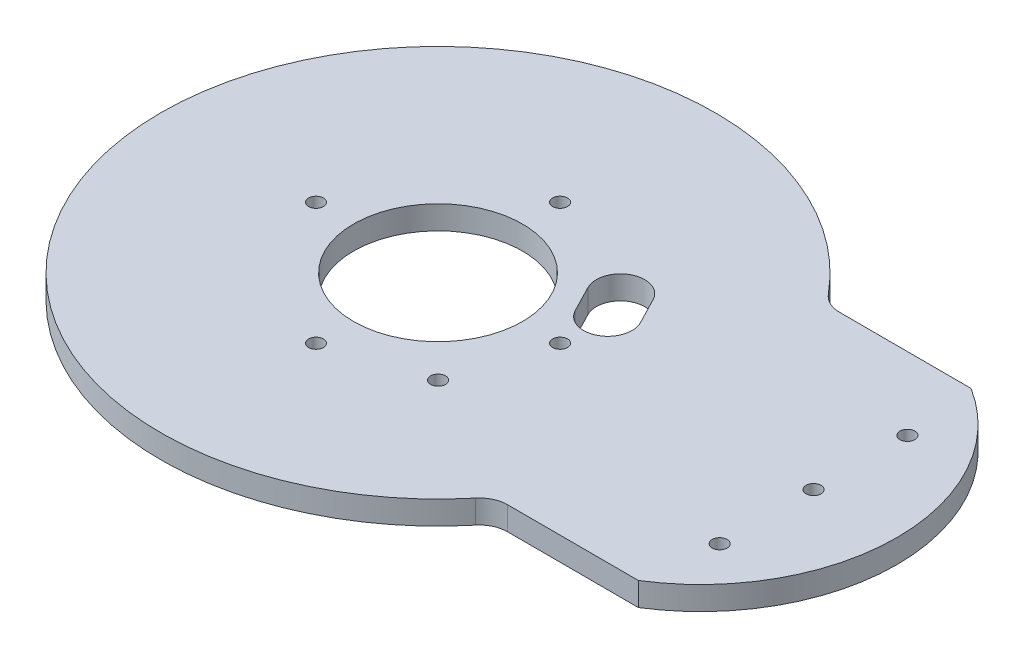
ISO-10303-21;
HEADER;
FILE_DESCRIPTION(('STEP AP214'),'2;1');
FILE_NAME('part.step','',(''),(''),'','','');
FILE_SCHEMA(('AUTOMOTIVE_DESIGN { 1 0 10303 214 1 1 1 1 }'));
ENDSEC;
DATA;
#1=APPLICATION_CONTEXT('core data for automotive mechanical design processes');
#2=APPLICATION_PROTOCOL_DEFINITION('international standard','automotive_design',2000,#1);
#3=PRODUCT_CONTEXT('',#1,'mechanical');
#4=PRODUCT('Part','Part','',(#3));
#5=PRODUCT_RELATED_PRODUCT_CATEGORY('part','',(#4));
#6=PRODUCT_DEFINITION_FORMATION('','',#4);
#7=PRODUCT_DEFINITION_CONTEXT('part definition',#1,'design');
#8=PRODUCT_DEFINITION('design','',#6,#7);
#9=PRODUCT_DEFINITION_SHAPE('','',#8);
#10=(LENGTH_UNIT() NAMED_UNIT(*) SI_UNIT(.MILLI.,.METRE.));
#11=(NAMED_UNIT(*) PLANE_ANGLE_UNIT() SI_UNIT($,.RADIAN.));
#12=(NAMED_UNIT(*) SI_UNIT($,.STERADIAN.) SOLID_ANGLE_UNIT());
#13=UNCERTAINTY_MEASURE_WITH_UNIT(LENGTH_MEASURE(1.E-05),#10,'distance_accuracy_value','');
#14=(GEOMETRIC_REPRESENTATION_CONTEXT(3) GLOBAL_UNCERTAINTY_ASSIGNED_CONTEXT((#13)) GLOBAL_UNIT_ASSIGNED_CONTEXT((#10,
#11,#12)) REPRESENTATION_CONTEXT('',''));
#15=CARTESIAN_POINT('',(0.,0.,0.));
#16=DIRECTION('',(0.,0.,1.));
#17=DIRECTION('',(1.,0.,0.));
#18=AXIS2_PLACEMENT_3D('',#15,#16,#17);
#19=CARTESIAN_POINT('',(-75.0000000000001,6.35,0.));
#20=DIRECTION('',(0.,1.,0.));
#21=DIRECTION('',(0.,0.,1.));
#22=AXIS2_PLACEMENT_3D('',#19,#20,#21);
#23=PLANE('',#22);
#24=CARTESIAN_POINT('',(-45.4313890152023,6.35,-19.8022772061494));
#25=DIRECTION('',(0.,1.,0.));
#26=DIRECTION('',(0.,0.,1.));
#27=AXIS2_PLACEMENT_3D('',#24,#25,#26);
#28=CIRCLE('',#27,6.55197648199999);
#29=CARTESIAN_POINT('',(-39.6125329501203,6.35,-22.8138067036871));
#30=VERTEX_POINT('',#29);
#31=CARTESIAN_POINT('',(-51.2502450802842,6.35,-16.7907477086116));
#32=VERTEX_POINT('',#31);
#33=EDGE_CURVE('E47',#30,#32,#28,.T.);
#34=ORIENTED_EDGE('',*,*,#33,.F.);
#35=DIRECTION('',(-0.459636799034804,0.,-0.888106982842179));
#36=VECTOR('',#35,1.);
#37=CARTESIAN_POINT('',(-39.6125329501203,6.35,-22.8138067036871));
#38=LINE('',#37,#36);
#39=CARTESIAN_POINT('',(-35.9393740067247,6.35,-15.7165548875378));
#40=VERTEX_POINT('',#39);
#41=EDGE_CURVE('E126',#40,#30,#38,.T.);
#42=ORIENTED_EDGE('',*,*,#41,.F.);
#43=CARTESIAN_POINT('',(-41.7582300718067,6.35,-12.70502539));
#44=DIRECTION('',(0.,1.,0.));
#45=DIRECTION('',(0.,0.,1.));
#46=AXIS2_PLACEMENT_3D('',#43,#44,#45);
#47=CIRCLE('',#46,6.551976482);
#48=CARTESIAN_POINT('',(-47.5770861368886,6.35,-9.69349589246222));
#49=VERTEX_POINT('',#48);
#50=EDGE_CURVE('E129',#49,#40,#47,.T.);
#51=ORIENTED_EDGE('',*,*,#50,.F.);
#52=DIRECTION('',(0.459636799034802,0.,0.888106982842181));
#53=VECTOR('',#52,1.);
#54=CARTESIAN_POINT('',(-51.2502450802842,6.35,-16.7907477086116));
#55=LINE('',#54,#53);
#56=EDGE_CURVE('E135',#32,#49,#55,.T.);
#57=ORIENTED_EDGE('',*,*,#56,.F.);
#58=EDGE_LOOP('',(#34,#42,#51,#57));
#59=FACE_BOUND('',#58,.T.);
#60=CARTESIAN_POINT('',(26.5999999999999,6.35,0.));
#61=DIRECTION('',(0.,1.,0.));
#62=DIRECTION('',(0.,0.,1.));
#63=AXIS2_PLACEMENT_3D('',#60,#61,#62);
#64=CIRCLE('',#63,2.01930000000001);
#65=CARTESIAN_POINT('',(26.5999999999999,6.35,2.0193));
#66=VERTEX_POINT('',#65);
#67=EDGE_CURVE('E198',#66,#66,#64,.T.);
#68=ORIENTED_EDGE('',*,*,#67,.F.);
#69=EDGE_LOOP('',(#68));
#70=FACE_BOUND('',#69,.T.);
#71=CARTESIAN_POINT('',(-75.0000000000001,6.34999999999999,0.));
#72=DIRECTION('',(0.,1.,0.));
#73=DIRECTION('',(0.,0.,1.));
#74=AXIS2_PLACEMENT_3D('',#71,#72,#73);
#75=CIRCLE('',#74,22.86);
#76=CARTESIAN_POINT('',(-75.0000000000001,6.34999999999999,22.86));
#77=VERTEX_POINT('',#76);
#78=EDGE_CURVE('E189',#77,#77,#75,.T.);
#79=ORIENTED_EDGE('',*,*,#78,.F.);
#80=EDGE_LOOP('',(#79));
#81=FACE_BOUND('',#80,.T.);
#82=CARTESIAN_POINT('',(-49.8362072459857,6.34999999999999,25.1637927540141));
#83=DIRECTION('',(0.,1.,0.));
#84=DIRECTION('',(0.,0.,1.));
#85=AXIS2_PLACEMENT_3D('',#82,#83,#84);
#86=CIRCLE('',#85,2.0193);
#87=CARTESIAN_POINT('',(-49.8362072459857,6.34999999999999,27.1830927540141));
#88=VERTEX_POINT('',#87);
#89=EDGE_CURVE('E183',#88,#88,#86,.T.);
#90=ORIENTED_EDGE('',*,*,#89,.F.);
#91=EDGE_LOOP('',(#90));
#92=FACE_BOUND('',#91,.T.);
#93=CARTESIAN_POINT('',(-41.980000000001,6.34999999999999,-5.68989300120393E-13));
#94=DIRECTION('',(0.,1.,0.));
#95=DIRECTION('',(0.,0.,1.));
#96=AXIS2_PLACEMENT_3D('',#93,#94,#95);
#97=CIRCLE('',#96,2.0193);
#98=CARTESIAN_POINT('',(-41.980000000001,6.34999999999999,2.01929999999943));
#99=VERTEX_POINT('',#98);
#100=EDGE_CURVE('E177',#99,#99,#97,.T.);
#101=ORIENTED_EDGE('',*,*,#100,.F.);
#102=EDGE_LOOP('',(#101));
#103=FACE_BOUND('',#102,.T.);
#104=CARTESIAN_POINT('',(-75.0000000000001,6.34999999999999,33.02));
#105=DIRECTION('',(0.,1.,0.));
#106=DIRECTION('',(0.,0.,1.));
#107=AXIS2_PLACEMENT_3D('',#104,#105,#106);
#108=CIRCLE('',#107,2.01930000000001);
#109=CARTESIAN_POINT('',(-75.0000000000001,6.34999999999999,35.0393));
#110=VERTEX_POINT('',#109);
#111=EDGE_CURVE('E171',#110,#110,#108,.T.);
#112=ORIENTED_EDGE('',*,*,#111,.F.);
#113=EDGE_LOOP('',(#112));
#114=FACE_BOUND('',#113,.T.);
#115=CARTESIAN_POINT('',(-108.020000000001,6.34999999999999,8.32667268468867E-13));
#116=DIRECTION('',(0.,1.,0.));
#117=DIRECTION('',(0.,0.,1.));
#118=AXIS2_PLACEMENT_3D('',#115,#116,#117);
#119=CIRCLE('',#118,2.01930000000001);
#120=CARTESIAN_POINT('',(-108.020000000001,6.34999999999999,2.01930000000084));
#121=VERTEX_POINT('',#120);
#122=EDGE_CURVE('E165',#121,#121,#119,.T.);
#123=ORIENTED_EDGE('',*,*,#122,.F.);
#124=EDGE_LOOP('',(#123));
#125=FACE_BOUND('',#124,.T.);
#126=CARTESIAN_POINT('',(-75.0000000000017,6.34999999999999,-33.02));
#127=DIRECTION('',(0.,1.,0.));
#128=DIRECTION('',(0.,0.,1.));
#129=AXIS2_PLACEMENT_3D('',#126,#127,#128);
#130=CIRCLE('',#129,2.0193);
#131=CARTESIAN_POINT('',(-75.0000000000017,6.34999999999999,-31.0007));
#132=VERTEX_POINT('',#131);
#133=EDGE_CURVE('E161',#132,#132,#130,.T.);
#134=ORIENTED_EDGE('',*,*,#133,.F.);
#135=EDGE_LOOP('',(#134));
#136=FACE_BOUND('',#135,.T.);
#137=CARTESIAN_POINT('',(26.5999999999999,6.35,25.4));
#138=DIRECTION('',(0.,1.,0.));
#139=DIRECTION('',(0.,0.,1.));
#140=AXIS2_PLACEMENT_3D('',#137,#138,#139);
#141=CIRCLE('',#140,2.0193);
#142=CARTESIAN_POINT('',(26.5999999999999,6.35,27.4193));
#143=VERTEX_POINT('',#142);
#144=EDGE_CURVE('E155',#143,#143,#141,.T.);
#145=ORIENTED_EDGE('',*,*,#144,.F.);
#146=EDGE_LOOP('',(#145));
#147=FACE_BOUND('',#146,.T.);
#148=CARTESIAN_POINT('',(26.5999999999999,6.35,-25.4));
#149=DIRECTION('',(0.,1.,0.));
#150=DIRECTION('',(0.,0.,1.));
#151=AXIS2_PLACEMENT_3D('',#148,#149,#150);
#152=CIRCLE('',#151,2.0193);
#153=CARTESIAN_POINT('',(26.5999999999999,6.35,-23.3807));
#154=VERTEX_POINT('',#153);
#155=EDGE_CURVE('E148',#154,#154,#152,.T.);
#156=ORIENTED_EDGE('',*,*,#155,.F.);
#157=EDGE_LOOP('',(#156));
#158=FACE_BOUND('',#157,.T.);
#159=CARTESIAN_POINT('',(-3.94349539851306,6.35,0.));
#160=DIRECTION('',(0.,-1.,0.));
#161=DIRECTION('',(0.,0.,-1.));
#162=AXIS2_PLACEMENT_3D('',#159,#160,#161);
#163=CIRCLE('',#162,53.0754726752629);
#164=CARTESIAN_POINT('',(24.1991727609629,6.35,-44.9999558729583));
#165=VERTEX_POINT('',#164);
#166=CARTESIAN_POINT('',(24.1991727609629,6.35,44.9999558729584));
#167=VERTEX_POINT('',#166);
#168=EDGE_CURVE('E141',#165,#167,#163,.T.);
#169=ORIENTED_EDGE('',*,*,#168,.F.);
#170=DIRECTION('',(-0.999998670387748,0.,-0.00163071233998099));
#171=VECTOR('',#170,1.);
#172=CARTESIAN_POINT('',(24.1991727609629,6.35,-44.9999558729584));
#173=LINE('',#172,#171);
#174=CARTESIAN_POINT('',(-11.3627251739013,6.35,-45.0579471758599));
#175=VERTEX_POINT('',#174);
#176=EDGE_CURVE('E211',#165,#175,#173,.T.);
#177=ORIENTED_EDGE('',*,*,#176,.T.);
#178=CARTESIAN_POINT('',(-11.3502991458706,6.35,-52.6779370442145));
#179=DIRECTION('',(0.,1.,0.));
#180=DIRECTION('',(0.,0.,1.));
#181=AXIS2_PLACEMENT_3D('',#178,#179,#180);
#182=CIRCLE('',#181,7.62);
#183=CARTESIAN_POINT('',(-17.2205986589789,6.35,-47.81954393266));
#184=VERTEX_POINT('',#183);
#185=EDGE_CURVE('E11',#175,#184,#182,.F.);
#186=ORIENTED_EDGE('',*,*,#185,.T.);
#187=CARTESIAN_POINT('',(-75.0000000000001,6.35,0.));
#188=DIRECTION('',(0.,1.,0.));
#189=DIRECTION('',(0.,0.,1.));
#190=AXIS2_PLACEMENT_3D('',#187,#188,#189);
#191=CIRCLE('',#190,75.00112);
#192=CARTESIAN_POINT('',(-17.1337702696779,6.35,47.7144365790058));
#193=VERTEX_POINT('',#192);
#194=EDGE_CURVE('E204',#184,#193,#191,.T.);
#195=ORIENTED_EDGE('',*,*,#194,.T.);
#196=CARTESIAN_POINT('',(-11.2546491239529,6.35,52.5621509428983));
#197=DIRECTION('',(0.,1.,0.));
#198=DIRECTION('',(0.,0.,1.));
#199=AXIS2_PLACEMENT_3D('',#196,#197,#198);
#200=CIRCLE('',#199,7.62);
#201=CARTESIAN_POINT('',(-11.2422230959222,6.35,44.9421610745437));
#202=VERTEX_POINT('',#201);
#203=EDGE_CURVE('E238',#193,#202,#200,.F.);
#204=ORIENTED_EDGE('',*,*,#203,.T.);
#205=DIRECTION('',(0.999998670387748,0.,0.00163071233998107));
#206=VECTOR('',#205,1.);
#207=CARTESIAN_POINT('',(24.1991727609629,6.35,44.9999558729583));
#208=LINE('',#207,#206);
#209=EDGE_CURVE('E207',#202,#167,#208,.T.);
#210=ORIENTED_EDGE('',*,*,#209,.T.);
#211=EDGE_LOOP('',(#169,#177,#186,#195,#204,#210));
#212=FACE_BOUND('',#211,.T.);
#213=ADVANCED_FACE('F32',(#59,#70,#81,#92,#103,#114,#125,#136,#147,#158,#212),#23,.T.);
#214=CARTESIAN_POINT('',(-75.0000000000001,0.,0.));
#215=DIRECTION('',(0.,1.,0.));
#216=DIRECTION('',(0.,0.,1.));
#217=AXIS2_PLACEMENT_3D('',#214,#215,#216);
#218=PLANE('',#217);
#219=DIRECTION('',(-0.459636799034804,0.,-0.888106982842179));
#220=VECTOR('',#219,1.);
#221=CARTESIAN_POINT('',(-39.6125329501203,0.,-22.8138067036871));
#222=LINE('',#221,#220);
#223=CARTESIAN_POINT('',(-35.9393740067247,0.,-15.7165548875378));
#224=VERTEX_POINT('',#223);
#225=CARTESIAN_POINT('',(-39.6125329501203,0.,-22.8138067036871));
#226=VERTEX_POINT('',#225);
#227=EDGE_CURVE('E116',#224,#226,#222,.T.);
#228=ORIENTED_EDGE('',*,*,#227,.T.);
#229=CARTESIAN_POINT('',(-45.4313890152023,0.,-19.8022772061494));
#230=DIRECTION('',(0.,1.,0.));
#231=DIRECTION('',(0.,0.,1.));
#232=AXIS2_PLACEMENT_3D('',#229,#230,#231);
#233=CIRCLE('',#232,6.55197648199999);
#234=CARTESIAN_POINT('',(-51.2502450802842,0.,-16.7907477086116));
#235=VERTEX_POINT('',#234);
#236=EDGE_CURVE('E110',#226,#235,#233,.T.);
#237=ORIENTED_EDGE('',*,*,#236,.T.);
#238=DIRECTION('',(0.459636799034802,0.,0.888106982842181));
#239=VECTOR('',#238,1.);
#240=CARTESIAN_POINT('',(-51.2502450802842,0.,-16.7907477086116));
#241=LINE('',#240,#239);
#242=CARTESIAN_POINT('',(-47.5770861368886,0.,-9.69349589246222));
#243=VERTEX_POINT('',#242);
#244=EDGE_CURVE('E119',#235,#243,#241,.T.);
#245=ORIENTED_EDGE('',*,*,#244,.T.);
#246=CARTESIAN_POINT('',(-41.7582300718067,0.,-12.70502539));
#247=DIRECTION('',(0.,1.,0.));
#248=DIRECTION('',(0.,0.,1.));
#249=AXIS2_PLACEMENT_3D('',#246,#247,#248);
#250=CIRCLE('',#249,6.551976482);
#251=EDGE_CURVE('E55',#243,#224,#250,.T.);
#252=ORIENTED_EDGE('',*,*,#251,.T.);
#253=EDGE_LOOP('',(#228,#237,#245,#252));
#254=FACE_BOUND('',#253,.T.);
#255=CARTESIAN_POINT('',(26.5999999999999,0.,-25.4));
#256=DIRECTION('',(0.,1.,0.));
#257=DIRECTION('',(0.,0.,1.));
#258=AXIS2_PLACEMENT_3D('',#255,#256,#257);
#259=CIRCLE('',#258,2.0193);
#260=CARTESIAN_POINT('',(26.5999999999999,0.,-23.3807));
#261=VERTEX_POINT('',#260);
#262=EDGE_CURVE('E152',#261,#261,#259,.T.);
#263=ORIENTED_EDGE('',*,*,#262,.T.);
#264=EDGE_LOOP('',(#263));
#265=FACE_BOUND('',#264,.T.);
#266=CARTESIAN_POINT('',(26.5999999999999,0.,25.4));
#267=DIRECTION('',(0.,1.,0.));
#268=DIRECTION('',(0.,0.,1.));
#269=AXIS2_PLACEMENT_3D('',#266,#267,#268);
#270=CIRCLE('',#269,2.0193);
#271=CARTESIAN_POINT('',(26.5999999999999,0.,27.4193));
#272=VERTEX_POINT('',#271);
#273=EDGE_CURVE('E158',#272,#272,#270,.T.);
#274=ORIENTED_EDGE('',*,*,#273,.T.);
#275=EDGE_LOOP('',(#274));
#276=FACE_BOUND('',#275,.T.);
#277=CARTESIAN_POINT('',(-75.0000000000017,0.,-33.02));
#278=DIRECTION('',(0.,1.,0.));
#279=DIRECTION('',(0.,0.,1.));
#280=AXIS2_PLACEMENT_3D('',#277,#278,#279);
#281=CIRCLE('',#280,2.0193);
#282=CARTESIAN_POINT('',(-75.0000000000017,0.,-31.0007));
#283=VERTEX_POINT('',#282);
#284=EDGE_CURVE('E162',#283,#283,#281,.T.);
#285=ORIENTED_EDGE('',*,*,#284,.T.);
#286=EDGE_LOOP('',(#285));
#287=FACE_BOUND('',#286,.T.);
#288=CARTESIAN_POINT('',(-108.020000000001,0.,8.32667268468867E-13));
#289=DIRECTION('',(0.,1.,0.));
#290=DIRECTION('',(0.,0.,1.));
#291=AXIS2_PLACEMENT_3D('',#288,#289,#290);
#292=CIRCLE('',#291,2.01930000000001);
#293=CARTESIAN_POINT('',(-108.020000000001,0.,2.01930000000084));
#294=VERTEX_POINT('',#293);
#295=EDGE_CURVE('E168',#294,#294,#292,.T.);
#296=ORIENTED_EDGE('',*,*,#295,.T.);
#297=EDGE_LOOP('',(#296));
#298=FACE_BOUND('',#297,.T.);
#299=CARTESIAN_POINT('',(-75.0000000000001,0.,33.02));
#300=DIRECTION('',(0.,1.,0.));
#301=DIRECTION('',(0.,0.,1.));
#302=AXIS2_PLACEMENT_3D('',#299,#300,#301);
#303=CIRCLE('',#302,2.01930000000001);
#304=CARTESIAN_POINT('',(-75.0000000000001,0.,35.0393));
#305=VERTEX_POINT('',#304);
#306=EDGE_CURVE('E174',#305,#305,#303,.T.);
#307=ORIENTED_EDGE('',*,*,#306,.T.);
#308=EDGE_LOOP('',(#307));
#309=FACE_BOUND('',#308,.T.);
#310=CARTESIAN_POINT('',(-41.980000000001,0.,-5.68989300120393E-13));
#311=DIRECTION('',(0.,1.,0.));
#312=DIRECTION('',(0.,0.,1.));
#313=AXIS2_PLACEMENT_3D('',#310,#311,#312);
#314=CIRCLE('',#313,2.0193);
#315=CARTESIAN_POINT('',(-41.980000000001,0.,2.01929999999943));
#316=VERTEX_POINT('',#315);
#317=EDGE_CURVE('E180',#316,#316,#314,.T.);
#318=ORIENTED_EDGE('',*,*,#317,.T.);
#319=EDGE_LOOP('',(#318));
#320=FACE_BOUND('',#319,.T.);
#321=CARTESIAN_POINT('',(-49.8362072459857,0.,25.1637927540141));
#322=DIRECTION('',(0.,1.,0.));
#323=DIRECTION('',(0.,0.,1.));
#324=AXIS2_PLACEMENT_3D('',#321,#322,#323);
#325=CIRCLE('',#324,2.0193);
#326=CARTESIAN_POINT('',(-49.8362072459857,0.,27.1830927540141));
#327=VERTEX_POINT('',#326);
#328=EDGE_CURVE('E186',#327,#327,#325,.T.);
#329=ORIENTED_EDGE('',*,*,#328,.T.);
#330=EDGE_LOOP('',(#329));
#331=FACE_BOUND('',#330,.T.);
#332=CARTESIAN_POINT('',(-75.0000000000001,0.,0.));
#333=DIRECTION('',(0.,1.,0.));
#334=DIRECTION('',(0.,0.,1.));
#335=AXIS2_PLACEMENT_3D('',#332,#333,#334);
#336=CIRCLE('',#335,22.86);
#337=CARTESIAN_POINT('',(-75.0000000000001,0.,22.86));
#338=VERTEX_POINT('',#337);
#339=EDGE_CURVE('E192',#338,#338,#336,.T.);
#340=ORIENTED_EDGE('',*,*,#339,.T.);
#341=EDGE_LOOP('',(#340));
#342=FACE_BOUND('',#341,.T.);
#343=CARTESIAN_POINT('',(26.5999999999999,0.,0.));
#344=DIRECTION('',(0.,1.,0.));
#345=DIRECTION('',(0.,0.,1.));
#346=AXIS2_PLACEMENT_3D('',#343,#344,#345);
#347=CIRCLE('',#346,2.01930000000001);
#348=CARTESIAN_POINT('',(26.5999999999999,0.,2.0193));
#349=VERTEX_POINT('',#348);
#350=EDGE_CURVE('E195',#349,#349,#347,.T.);
#351=ORIENTED_EDGE('',*,*,#350,.T.);
#352=EDGE_LOOP('',(#351));
#353=FACE_BOUND('',#352,.T.);
#354=DIRECTION('',(-0.999998670387748,0.,-0.00163071233998099));
#355=VECTOR('',#354,1.);
#356=CARTESIAN_POINT('',(24.1991727609629,0.,-44.9999558729584));
#357=LINE('',#356,#355);
#358=CARTESIAN_POINT('',(24.1991727609629,0.,-44.9999558729584));
#359=VERTEX_POINT('',#358);
#360=CARTESIAN_POINT('',(-11.3627251739013,0.,-45.0579471758599));
#361=VERTEX_POINT('',#360);
#362=EDGE_CURVE('E208',#359,#361,#357,.T.);
#363=ORIENTED_EDGE('',*,*,#362,.F.);
#364=CARTESIAN_POINT('',(-3.94349539851306,0.,0.));
#365=DIRECTION('',(0.,-1.,0.));
#366=DIRECTION('',(0.,0.,-1.));
#367=AXIS2_PLACEMENT_3D('',#364,#365,#366);
#368=CIRCLE('',#367,53.0754726752629);
#369=CARTESIAN_POINT('',(24.1991727609629,0.,44.9999558729584));
#370=VERTEX_POINT('',#369);
#371=EDGE_CURVE('E145',#359,#370,#368,.T.);
#372=ORIENTED_EDGE('',*,*,#371,.T.);
#373=DIRECTION('',(0.999998670387748,0.,0.00163071233998107));
#374=VECTOR('',#373,1.);
#375=CARTESIAN_POINT('',(24.1991727609629,0.,44.9999558729583));
#376=LINE('',#375,#374);
#377=CARTESIAN_POINT('',(-11.2422230959222,0.,44.9421610745437));
#378=VERTEX_POINT('',#377);
#379=EDGE_CURVE('E217',#378,#370,#376,.T.);
#380=ORIENTED_EDGE('',*,*,#379,.F.);
#381=CARTESIAN_POINT('',(-11.2546491239529,0.,52.5621509428983));
#382=DIRECTION('',(0.,1.,0.));
#383=DIRECTION('',(0.,0.,1.));
#384=AXIS2_PLACEMENT_3D('',#381,#382,#383);
#385=CIRCLE('',#384,7.62);
#386=CARTESIAN_POINT('',(-17.1337702696779,0.,47.7144365790058));
#387=VERTEX_POINT('',#386);
#388=EDGE_CURVE('E236',#378,#387,#385,.T.);
#389=ORIENTED_EDGE('',*,*,#388,.T.);
#390=CARTESIAN_POINT('',(-75.0000000000001,0.,0.));
#391=DIRECTION('',(0.,1.,0.));
#392=DIRECTION('',(0.,0.,1.));
#393=AXIS2_PLACEMENT_3D('',#390,#391,#392);
#394=CIRCLE('',#393,75.00112);
#395=CARTESIAN_POINT('',(-17.2205986589789,0.,-47.81954393266));
#396=VERTEX_POINT('',#395);
#397=EDGE_CURVE('E201',#396,#387,#394,.T.);
#398=ORIENTED_EDGE('',*,*,#397,.F.);
#399=CARTESIAN_POINT('',(-11.3502991458706,0.,-52.6779370442145));
#400=DIRECTION('',(0.,1.,0.));
#401=DIRECTION('',(0.,0.,1.));
#402=AXIS2_PLACEMENT_3D('',#399,#400,#401);
#403=CIRCLE('',#402,7.62);
#404=EDGE_CURVE('E40',#396,#361,#403,.T.);
#405=ORIENTED_EDGE('',*,*,#404,.T.);
#406=EDGE_LOOP('',(#363,#372,#380,#389,#398,#405));
#407=FACE_BOUND('',#406,.T.);
#408=ADVANCED_FACE('F123',(#254,#265,#276,#287,#298,#309,#320,#331,#342,#353,#407),#218,.F.);
#409=CARTESIAN_POINT('',(-75.0000000000001,6.35,0.));
#410=DIRECTION('',(0.,-1.,0.));
#411=DIRECTION('',(0.,0.,-1.));
#412=AXIS2_PLACEMENT_3D('',#409,#410,#411);
#413=CYLINDRICAL_SURFACE('',#412,75.00112);
#414=ORIENTED_EDGE('',*,*,#397,.T.);
#415=DIRECTION('',(0.,-1.,0.));
#416=VECTOR('',#415,1.);
#417=CARTESIAN_POINT('',(-17.1337702696779,6.35,47.7144365790058));
#418=LINE('',#417,#416);
#419=EDGE_CURVE('E232',#387,#193,#418,.F.);
#420=ORIENTED_EDGE('',*,*,#419,.T.);
#421=ORIENTED_EDGE('',*,*,#194,.F.);
#422=DIRECTION('',(0.,-1.,0.));
#423=VECTOR('',#422,1.);
#424=CARTESIAN_POINT('',(-17.2205986589789,6.35,-47.81954393266));
#425=LINE('',#424,#423);
#426=EDGE_CURVE('E229',#184,#396,#425,.T.);
#427=ORIENTED_EDGE('',*,*,#426,.T.);
#428=EDGE_LOOP('',(#414,#420,#421,#427));
#429=FACE_BOUND('',#428,.T.);
#430=ADVANCED_FACE('F254',(#429),#413,.T.);
#431=CARTESIAN_POINT('',(24.1991727609629,6.35,44.9999558729583));
#432=DIRECTION('',(0.00163071233998107,0.,-0.999998670387748));
#433=DIRECTION('',(-0.999998670387748,0.,-0.00163071233998107));
#434=AXIS2_PLACEMENT_3D('',#431,#432,#433);
#435=PLANE('',#434);
#436=ORIENTED_EDGE('',*,*,#209,.F.);
#437=DIRECTION('',(0.,1.,0.));
#438=VECTOR('',#437,1.);
#439=CARTESIAN_POINT('',(-11.2422230959222,0.,44.9421610745437));
#440=LINE('',#439,#438);
#441=EDGE_CURVE('E226',#202,#378,#440,.F.);
#442=ORIENTED_EDGE('',*,*,#441,.T.);
#443=ORIENTED_EDGE('',*,*,#379,.T.);
#444=DIRECTION('',(0.,-1.,0.));
#445=VECTOR('',#444,1.);
#446=CARTESIAN_POINT('',(24.1991727609629,6.35,44.9999558729583));
#447=LINE('',#446,#445);
#448=EDGE_CURVE('E224',#167,#370,#447,.T.);
#449=ORIENTED_EDGE('',*,*,#448,.F.);
#450=EDGE_LOOP('',(#436,#442,#443,#449));
#451=FACE_BOUND('',#450,.T.);
#452=ADVANCED_FACE('F262',(#451),#435,.F.);
#453=CARTESIAN_POINT('',(24.1991727609629,6.35,-44.9999558729584));
#454=DIRECTION('',(-0.00163071233998099,0.,0.999998670387748));
#455=DIRECTION('',(0.999998670387748,0.,0.00163071233998099));
#456=AXIS2_PLACEMENT_3D('',#453,#454,#455);
#457=PLANE('',#456);
#458=ORIENTED_EDGE('',*,*,#362,.T.);
#459=DIRECTION('',(0.,1.,0.));
#460=VECTOR('',#459,1.);
#461=CARTESIAN_POINT('',(-11.3627251739013,6.35,-45.0579471758599));
#462=LINE('',#461,#460);
#463=EDGE_CURVE('E234',#361,#175,#462,.T.);
#464=ORIENTED_EDGE('',*,*,#463,.T.);
#465=ORIENTED_EDGE('',*,*,#176,.F.);
#466=DIRECTION('',(0.,-1.,0.));
#467=VECTOR('',#466,1.);
#468=CARTESIAN_POINT('',(24.1991727609629,6.35,-44.9999558729584));
#469=LINE('',#468,#467);
#470=EDGE_CURVE('E214',#165,#359,#469,.T.);
#471=ORIENTED_EDGE('',*,*,#470,.T.);
#472=EDGE_LOOP('',(#458,#464,#465,#471));
#473=FACE_BOUND('',#472,.T.);
#474=ADVANCED_FACE('F246',(#473),#457,.F.);
#475=CARTESIAN_POINT('',(26.5999999999999,6.35,0.));
#476=DIRECTION('',(0.,-1.,0.));
#477=DIRECTION('',(0.,0.,-1.));
#478=AXIS2_PLACEMENT_3D('',#475,#476,#477);
#479=CYLINDRICAL_SURFACE('',#478,2.01930000000001);
#480=ORIENTED_EDGE('',*,*,#67,.T.);
#481=EDGE_LOOP('',(#480));
#482=FACE_BOUND('',#481,.T.);
#483=ORIENTED_EDGE('',*,*,#350,.F.);
#484=EDGE_LOOP('',(#483));
#485=FACE_BOUND('',#484,.T.);
#486=ADVANCED_FACE('F287',(#482,#485),#479,.F.);
#487=CARTESIAN_POINT('',(-75.0000000000001,0.,0.));
#488=DIRECTION('',(0.,1.,0.));
#489=DIRECTION('',(0.,0.,1.));
#490=AXIS2_PLACEMENT_3D('',#487,#488,#489);
#491=CYLINDRICAL_SURFACE('',#490,22.86);
#492=ORIENTED_EDGE('',*,*,#339,.F.);
#493=EDGE_LOOP('',(#492));
#494=FACE_BOUND('',#493,.T.);
#495=ORIENTED_EDGE('',*,*,#78,.T.);
#496=EDGE_LOOP('',(#495));
#497=FACE_BOUND('',#496,.T.);
#498=ADVANCED_FACE('F323',(#494,#497),#491,.F.);
#499=CARTESIAN_POINT('',(-49.8362072459857,0.,25.1637927540141));
#500=DIRECTION('',(0.,1.,0.));
#501=DIRECTION('',(0.,0.,1.));
#502=AXIS2_PLACEMENT_3D('',#499,#500,#501);
#503=CYLINDRICAL_SURFACE('',#502,2.0193);
#504=ORIENTED_EDGE('',*,*,#328,.F.);
#505=EDGE_LOOP('',(#504));
#506=FACE_BOUND('',#505,.T.);
#507=ORIENTED_EDGE('',*,*,#89,.T.);
#508=EDGE_LOOP('',(#507));
#509=FACE_BOUND('',#508,.T.);
#510=ADVANCED_FACE('F320',(#506,#509),#503,.F.);
#511=CARTESIAN_POINT('',(-41.980000000001,0.,-5.68989300120393E-13));
#512=DIRECTION('',(0.,1.,0.));
#513=DIRECTION('',(0.,0.,1.));
#514=AXIS2_PLACEMENT_3D('',#511,#512,#513);
#515=CYLINDRICAL_SURFACE('',#514,2.0193);
#516=ORIENTED_EDGE('',*,*,#317,.F.);
#517=EDGE_LOOP('',(#516));
#518=FACE_BOUND('',#517,.T.);
#519=ORIENTED_EDGE('',*,*,#100,.T.);
#520=EDGE_LOOP('',(#519));
#521=FACE_BOUND('',#520,.T.);
#522=ADVANCED_FACE('F316',(#518,#521),#515,.F.);
#523=CARTESIAN_POINT('',(-75.0000000000001,0.,33.02));
#524=DIRECTION('',(0.,1.,0.));
#525=DIRECTION('',(0.,0.,1.));
#526=AXIS2_PLACEMENT_3D('',#523,#524,#525);
#527=CYLINDRICAL_SURFACE('',#526,2.01930000000001);
#528=ORIENTED_EDGE('',*,*,#306,.F.);
#529=EDGE_LOOP('',(#528));
#530=FACE_BOUND('',#529,.T.);
#531=ORIENTED_EDGE('',*,*,#111,.T.);
#532=EDGE_LOOP('',(#531));
#533=FACE_BOUND('',#532,.T.);
#534=ADVANCED_FACE('F307',(#530,#533),#527,.F.);
#535=CARTESIAN_POINT('',(-108.020000000001,0.,8.32667268468867E-13));
#536=DIRECTION('',(0.,1.,0.));
#537=DIRECTION('',(0.,0.,1.));
#538=AXIS2_PLACEMENT_3D('',#535,#536,#537);
#539=CYLINDRICAL_SURFACE('',#538,2.01930000000001);
#540=ORIENTED_EDGE('',*,*,#295,.F.);
#541=EDGE_LOOP('',(#540));
#542=FACE_BOUND('',#541,.T.);
#543=ORIENTED_EDGE('',*,*,#122,.T.);
#544=EDGE_LOOP('',(#543));
#545=FACE_BOUND('',#544,.T.);
#546=ADVANCED_FACE('F301',(#542,#545),#539,.F.);
#547=CARTESIAN_POINT('',(-75.0000000000017,0.,-33.02));
#548=DIRECTION('',(0.,1.,0.));
#549=DIRECTION('',(0.,0.,1.));
#550=AXIS2_PLACEMENT_3D('',#547,#548,#549);
#551=CYLINDRICAL_SURFACE('',#550,2.0193);
#552=ORIENTED_EDGE('',*,*,#284,.F.);
#553=EDGE_LOOP('',(#552));
#554=FACE_BOUND('',#553,.T.);
#555=ORIENTED_EDGE('',*,*,#133,.T.);
#556=EDGE_LOOP('',(#555));
#557=FACE_BOUND('',#556,.T.);
#558=ADVANCED_FACE('F296',(#554,#557),#551,.F.);
#559=CARTESIAN_POINT('',(-11.2546491239529,6.35,52.5621509428983));
#560=DIRECTION('',(0.,-1.,0.));
#561=DIRECTION('',(0.,0.,-1.));
#562=AXIS2_PLACEMENT_3D('',#559,#560,#561);
#563=CYLINDRICAL_SURFACE('',#562,7.62);
#564=ORIENTED_EDGE('',*,*,#203,.F.);
#565=ORIENTED_EDGE('',*,*,#419,.F.);
#566=ORIENTED_EDGE('',*,*,#388,.F.);
#567=ORIENTED_EDGE('',*,*,#441,.F.);
#568=EDGE_LOOP('',(#564,#565,#566,#567));
#569=FACE_BOUND('',#568,.T.);
#570=ADVANCED_FACE('F257',(#569),#563,.F.);
#571=CARTESIAN_POINT('',(-11.3502991458706,6.35,-52.6779370442145));
#572=DIRECTION('',(0.,-1.,0.));
#573=DIRECTION('',(0.,0.,-1.));
#574=AXIS2_PLACEMENT_3D('',#571,#572,#573);
#575=CYLINDRICAL_SURFACE('',#574,7.62);
#576=ORIENTED_EDGE('',*,*,#185,.F.);
#577=ORIENTED_EDGE('',*,*,#463,.F.);
#578=ORIENTED_EDGE('',*,*,#404,.F.);
#579=ORIENTED_EDGE('',*,*,#426,.F.);
#580=EDGE_LOOP('',(#576,#577,#578,#579));
#581=FACE_BOUND('',#580,.T.);
#582=ADVANCED_FACE('F34',(#581),#575,.F.);
#583=CARTESIAN_POINT('',(26.5999999999999,6.35,25.4));
#584=DIRECTION('',(0.,1.,0.));
#585=DIRECTION('',(0.,0.,1.));
#586=AXIS2_PLACEMENT_3D('',#583,#584,#585);
#587=CYLINDRICAL_SURFACE('',#586,2.0193);
#588=ORIENTED_EDGE('',*,*,#273,.F.);
#589=EDGE_LOOP('',(#588));
#590=FACE_BOUND('',#589,.T.);
#591=ORIENTED_EDGE('',*,*,#144,.T.);
#592=EDGE_LOOP('',(#591));
#593=FACE_BOUND('',#592,.T.);
#594=ADVANCED_FACE('F275',(#590,#593),#587,.F.);
#595=CARTESIAN_POINT('',(26.5999999999999,6.35,-25.4));
#596=DIRECTION('',(0.,1.,0.));
#597=DIRECTION('',(0.,0.,1.));
#598=AXIS2_PLACEMENT_3D('',#595,#596,#597);
#599=CYLINDRICAL_SURFACE('',#598,2.0193);
#600=ORIENTED_EDGE('',*,*,#262,.F.);
#601=EDGE_LOOP('',(#600));
#602=FACE_BOUND('',#601,.T.);
#603=ORIENTED_EDGE('',*,*,#155,.T.);
#604=EDGE_LOOP('',(#603));
#605=FACE_BOUND('',#604,.T.);
#606=ADVANCED_FACE('F267',(#602,#605),#599,.F.);
#607=CARTESIAN_POINT('',(-3.94349539851306,0.,0.));
#608=DIRECTION('',(0.,1.,0.));
#609=DIRECTION('',(0.,0.,1.));
#610=AXIS2_PLACEMENT_3D('',#607,#608,#609);
#611=CYLINDRICAL_SURFACE('',#610,53.0754726752629);
#612=ORIENTED_EDGE('',*,*,#168,.T.);
#613=ORIENTED_EDGE('',*,*,#448,.T.);
#614=ORIENTED_EDGE('',*,*,#371,.F.);
#615=ORIENTED_EDGE('',*,*,#470,.F.);
#616=EDGE_LOOP('',(#612,#613,#614,#615));
#617=FACE_BOUND('',#616,.T.);
#618=ADVANCED_FACE('F265',(#617),#611,.T.);
#619=CARTESIAN_POINT('',(-45.4313890152023,0.,-19.8022772061494));
#620=DIRECTION('',(0.,1.,0.));
#621=DIRECTION('',(0.,0.,1.));
#622=AXIS2_PLACEMENT_3D('',#619,#620,#621);
#623=CYLINDRICAL_SURFACE('',#622,6.55197648199999);
#624=ORIENTED_EDGE('',*,*,#33,.T.);
#625=DIRECTION('',(0.,1.,0.));
#626=VECTOR('',#625,1.);
#627=CARTESIAN_POINT('',(-51.2502450802842,0.,-16.7907477086116));
#628=LINE('',#627,#626);
#629=EDGE_CURVE('E106',#235,#32,#628,.T.);
#630=ORIENTED_EDGE('',*,*,#629,.F.);
#631=ORIENTED_EDGE('',*,*,#236,.F.);
#632=DIRECTION('',(0.,1.,0.));
#633=VECTOR('',#632,1.);
#634=CARTESIAN_POINT('',(-39.6125329501203,0.,-22.8138067036871));
#635=LINE('',#634,#633);
#636=EDGE_CURVE('E139',#226,#30,#635,.T.);
#637=ORIENTED_EDGE('',*,*,#636,.T.);
#638=EDGE_LOOP('',(#624,#630,#631,#637));
#639=FACE_BOUND('',#638,.T.);
#640=ADVANCED_FACE('F108',(#639),#623,.F.);
#641=CARTESIAN_POINT('',(-39.6125329501203,0.,-22.8138067036871));
#642=DIRECTION('',(0.888106982842179,0.,-0.459636799034804));
#643=DIRECTION('',(-0.459636799034804,0.,-0.888106982842179));
#644=AXIS2_PLACEMENT_3D('',#641,#642,#643);
#645=PLANE('',#644);
#646=ORIENTED_EDGE('',*,*,#41,.T.);
#647=ORIENTED_EDGE('',*,*,#636,.F.);
#648=ORIENTED_EDGE('',*,*,#227,.F.);
#649=DIRECTION('',(0.,1.,0.));
#650=VECTOR('',#649,1.);
#651=CARTESIAN_POINT('',(-35.9393740067247,0.,-15.7165548875378));
#652=LINE('',#651,#650);
#653=EDGE_CURVE('E142',#224,#40,#652,.T.);
#654=ORIENTED_EDGE('',*,*,#653,.T.);
#655=EDGE_LOOP('',(#646,#647,#648,#654));
#656=FACE_BOUND('',#655,.T.);
#657=ADVANCED_FACE('F273',(#656),#645,.F.);
#658=CARTESIAN_POINT('',(-41.7582300718067,0.,-12.70502539));
#659=DIRECTION('',(0.,1.,0.));
#660=DIRECTION('',(0.,0.,1.));
#661=AXIS2_PLACEMENT_3D('',#658,#659,#660);
#662=CYLINDRICAL_SURFACE('',#661,6.551976482);
#663=ORIENTED_EDGE('',*,*,#50,.T.);
#664=ORIENTED_EDGE('',*,*,#653,.F.);
#665=ORIENTED_EDGE('',*,*,#251,.F.);
#666=DIRECTION('',(0.,1.,0.));
#667=VECTOR('',#666,1.);
#668=CARTESIAN_POINT('',(-47.5770861368886,0.,-9.69349589246222));
#669=LINE('',#668,#667);
#670=EDGE_CURVE('E115',#243,#49,#669,.T.);
#671=ORIENTED_EDGE('',*,*,#670,.T.);
#672=EDGE_LOOP('',(#663,#664,#665,#671));
#673=FACE_BOUND('',#672,.T.);
#674=ADVANCED_FACE('F423',(#673),#662,.F.);
#675=CARTESIAN_POINT('',(-51.2502450802842,0.,-16.7907477086116));
#676=DIRECTION('',(-0.88810698284218,0.,0.459636799034802));
#677=DIRECTION('',(0.459636799034802,0.,0.88810698284218));
#678=AXIS2_PLACEMENT_3D('',#675,#676,#677);
#679=PLANE('',#678);
#680=ORIENTED_EDGE('',*,*,#56,.T.);
#681=ORIENTED_EDGE('',*,*,#670,.F.);
#682=ORIENTED_EDGE('',*,*,#244,.F.);
#683=ORIENTED_EDGE('',*,*,#629,.T.);
#684=EDGE_LOOP('',(#680,#681,#682,#683));
#685=FACE_BOUND('',#684,.T.);
#686=ADVANCED_FACE('F120',(#685),#679,.F.);
#687=CLOSED_SHELL('',(#213,#408,#430,#452,#474,#486,#498,#510,#522,#534,#546,#558,#570,#582,
#594,#606,#618,#640,#657,#674,#686));
#688=MANIFOLD_SOLID_BREP('B2',#687);
#689=ADVANCED_BREP_SHAPE_REPRESENTATION('',(#18,#688),#14);
#690=SHAPE_DEFINITION_REPRESENTATION(#9,#689);
ENDSEC;
END-ISO-10303-21;
